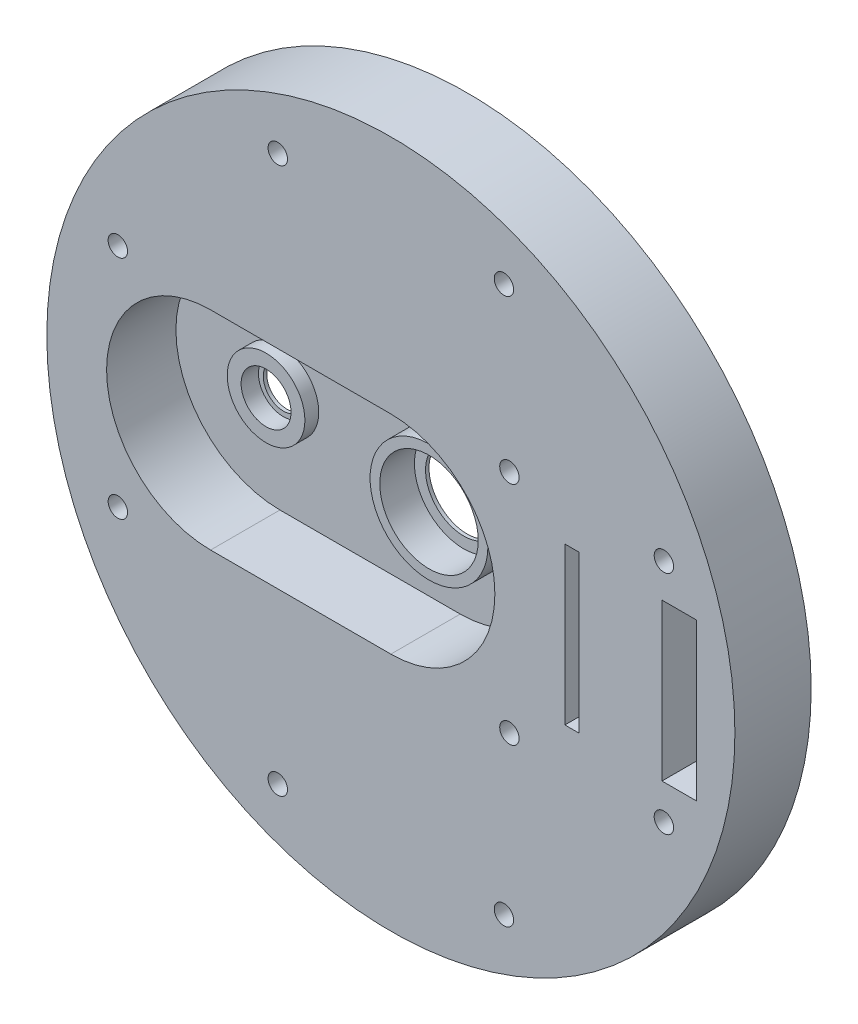
ISO-10303-21;
HEADER;
FILE_DESCRIPTION(('STEP AP214'),'2;1');
FILE_NAME('part.step','',(''),(''),'','','');
FILE_SCHEMA(('AUTOMOTIVE_DESIGN { 1 0 10303 214 1 1 1 1 }'));
ENDSEC;
DATA;
#1=APPLICATION_CONTEXT('core data for automotive mechanical design processes');
#2=APPLICATION_PROTOCOL_DEFINITION('international standard','automotive_design',2000,#1);
#3=PRODUCT_CONTEXT('',#1,'mechanical');
#4=PRODUCT('Part','Part','',(#3));
#5=PRODUCT_RELATED_PRODUCT_CATEGORY('part','',(#4));
#6=PRODUCT_DEFINITION_FORMATION('','',#4);
#7=PRODUCT_DEFINITION_CONTEXT('part definition',#1,'design');
#8=PRODUCT_DEFINITION('design','',#6,#7);
#9=PRODUCT_DEFINITION_SHAPE('','',#8);
#10=(LENGTH_UNIT() NAMED_UNIT(*) SI_UNIT(.MILLI.,.METRE.));
#11=(NAMED_UNIT(*) PLANE_ANGLE_UNIT() SI_UNIT($,.RADIAN.));
#12=(NAMED_UNIT(*) SI_UNIT($,.STERADIAN.) SOLID_ANGLE_UNIT());
#13=UNCERTAINTY_MEASURE_WITH_UNIT(LENGTH_MEASURE(1.E-05),#10,'distance_accuracy_value','');
#14=(GEOMETRIC_REPRESENTATION_CONTEXT(3) GLOBAL_UNCERTAINTY_ASSIGNED_CONTEXT((#13)) GLOBAL_UNIT_ASSIGNED_CONTEXT((#10,
#11,#12)) REPRESENTATION_CONTEXT('',''));
#15=CARTESIAN_POINT('',(0.,0.,0.));
#16=DIRECTION('',(0.,0.,1.));
#17=DIRECTION('',(1.,0.,0.));
#18=AXIS2_PLACEMENT_3D('',#15,#16,#17);
#19=CARTESIAN_POINT('',(0.,0.,0.));
#20=DIRECTION('',(0.,0.,1.));
#21=DIRECTION('',(1.,0.,0.));
#22=AXIS2_PLACEMENT_3D('',#19,#20,#21);
#23=PLANE('',#22);
#24=CARTESIAN_POINT('',(17.1,16.3,0.));
#25=DIRECTION('',(0.,0.,1.));
#26=DIRECTION('',(1.,0.,0.));
#27=AXIS2_PLACEMENT_3D('',#24,#25,#26);
#28=CIRCLE('',#27,1.40000000000219);
#29=CARTESIAN_POINT('',(18.5000000000022,16.3,0.));
#30=VERTEX_POINT('',#29);
#31=EDGE_CURVE('E138',#30,#30,#28,.T.);
#32=ORIENTED_EDGE('',*,*,#31,.T.);
#33=EDGE_LOOP('',(#32));
#34=FACE_BOUND('',#33,.T.);
#35=DIRECTION('',(1.,0.,0.));
#36=VECTOR('',#35,1.);
#37=CARTESIAN_POINT('',(44.1,-11.3,0.));
#38=LINE('',#37,#36);
#39=CARTESIAN_POINT('',(39.1,-11.3,0.));
#40=VERTEX_POINT('',#39);
#41=CARTESIAN_POINT('',(44.1,-11.3,0.));
#42=VERTEX_POINT('',#41);
#43=EDGE_CURVE('E50',#40,#42,#38,.T.);
#44=ORIENTED_EDGE('',*,*,#43,.T.);
#45=DIRECTION('',(0.,1.,0.));
#46=VECTOR('',#45,1.);
#47=CARTESIAN_POINT('',(44.1,-11.3,0.));
#48=LINE('',#47,#46);
#49=CARTESIAN_POINT('',(44.1,11.3,0.));
#50=VERTEX_POINT('',#49);
#51=EDGE_CURVE('E146',#42,#50,#48,.T.);
#52=ORIENTED_EDGE('',*,*,#51,.T.);
#53=DIRECTION('',(-1.,0.,0.));
#54=VECTOR('',#53,1.);
#55=CARTESIAN_POINT('',(44.1,11.3,0.));
#56=LINE('',#55,#54);
#57=CARTESIAN_POINT('',(39.1,11.3,0.));
#58=VERTEX_POINT('',#57);
#59=EDGE_CURVE('E153',#50,#58,#56,.T.);
#60=ORIENTED_EDGE('',*,*,#59,.T.);
#61=DIRECTION('',(0.,-1.,0.));
#62=VECTOR('',#61,1.);
#63=CARTESIAN_POINT('',(39.1,-11.3,0.));
#64=LINE('',#63,#62);
#65=EDGE_CURVE('E132',#58,#40,#64,.T.);
#66=ORIENTED_EDGE('',*,*,#65,.T.);
#67=EDGE_LOOP('',(#44,#52,#60,#66));
#68=FACE_BOUND('',#67,.T.);
#69=CARTESIAN_POINT('',(17.1,-16.3,0.));
#70=DIRECTION('',(0.,0.,1.));
#71=DIRECTION('',(1.,0.,0.));
#72=AXIS2_PLACEMENT_3D('',#69,#70,#71);
#73=CIRCLE('',#72,1.40000000000219);
#74=CARTESIAN_POINT('',(18.5000000000022,-16.3,0.));
#75=VERTEX_POINT('',#74);
#76=EDGE_CURVE('E161',#75,#75,#73,.T.);
#77=ORIENTED_EDGE('',*,*,#76,.T.);
#78=EDGE_LOOP('',(#77));
#79=FACE_BOUND('',#78,.T.);
#80=CARTESIAN_POINT('',(0.,0.,0.));
#81=DIRECTION('',(0.,0.,1.));
#82=DIRECTION('',(1.,0.,0.));
#83=AXIS2_PLACEMENT_3D('',#80,#81,#82);
#84=CIRCLE('',#83,49.62);
#85=CARTESIAN_POINT('',(49.62,0.,0.));
#86=VERTEX_POINT('',#85);
#87=EDGE_CURVE('E11',#86,#86,#84,.T.);
#88=ORIENTED_EDGE('',*,*,#87,.F.);
#89=EDGE_LOOP('',(#88));
#90=FACE_BOUND('',#89,.T.);
#91=CARTESIAN_POINT('',(-26.,0.,0.));
#92=DIRECTION('',(0.,0.,1.));
#93=DIRECTION('',(1.,0.,0.));
#94=AXIS2_PLACEMENT_3D('',#91,#92,#93);
#95=CIRCLE('',#94,2.9);
#96=CARTESIAN_POINT('',(-23.1,0.,0.));
#97=VERTEX_POINT('',#96);
#98=EDGE_CURVE('E277',#97,#97,#95,.F.);
#99=ORIENTED_EDGE('',*,*,#98,.F.);
#100=EDGE_LOOP('',(#99));
#101=FACE_BOUND('',#100,.T.);
#102=CARTESIAN_POINT('',(0.,0.,0.));
#103=DIRECTION('',(0.,0.,1.));
#104=DIRECTION('',(1.,0.,0.));
#105=AXIS2_PLACEMENT_3D('',#102,#103,#104);
#106=CIRCLE('',#105,5.5);
#107=CARTESIAN_POINT('',(5.5,0.,0.));
#108=VERTEX_POINT('',#107);
#109=EDGE_CURVE('E259',#108,#108,#106,.F.);
#110=ORIENTED_EDGE('',*,*,#109,.F.);
#111=EDGE_LOOP('',(#110));
#112=FACE_BOUND('',#111,.T.);
#113=CARTESIAN_POINT('',(-39.375745675631,16.3099678874002,0.));
#114=DIRECTION('',(0.,0.,1.));
#115=DIRECTION('',(1.,0.,0.));
#116=AXIS2_PLACEMENT_3D('',#113,#114,#115);
#117=CIRCLE('',#116,1.4);
#118=CARTESIAN_POINT('',(-37.975745675631,16.3099678874002,0.));
#119=VERTEX_POINT('',#118);
#120=EDGE_CURVE('E244',#119,#119,#117,.F.);
#121=ORIENTED_EDGE('',*,*,#120,.F.);
#122=EDGE_LOOP('',(#121));
#123=FACE_BOUND('',#122,.T.);
#124=CARTESIAN_POINT('',(-39.3757456756311,-16.3099678874002,0.));
#125=DIRECTION('',(0.,0.,1.));
#126=DIRECTION('',(1.,0.,0.));
#127=AXIS2_PLACEMENT_3D('',#124,#125,#126);
#128=CIRCLE('',#127,1.40000000000137);
#129=CARTESIAN_POINT('',(-37.9757456756297,-16.3099678874002,0.));
#130=VERTEX_POINT('',#129);
#131=EDGE_CURVE('E211',#130,#130,#128,.F.);
#132=ORIENTED_EDGE('',*,*,#131,.F.);
#133=EDGE_LOOP('',(#132));
#134=FACE_BOUND('',#133,.T.);
#135=CARTESIAN_POINT('',(-16.3099678874001,-39.3757456756312,0.));
#136=DIRECTION('',(0.,0.,1.));
#137=DIRECTION('',(1.,0.,0.));
#138=AXIS2_PLACEMENT_3D('',#135,#136,#137);
#139=CIRCLE('',#138,1.40000000000258);
#140=CARTESIAN_POINT('',(-14.9099678873975,-39.3757456756312,0.));
#141=VERTEX_POINT('',#140);
#142=EDGE_CURVE('E204',#141,#141,#139,.F.);
#143=ORIENTED_EDGE('',*,*,#142,.F.);
#144=EDGE_LOOP('',(#143));
#145=FACE_BOUND('',#144,.T.);
#146=CARTESIAN_POINT('',(16.3099678874002,-39.3757456756312,0.));
#147=DIRECTION('',(0.,0.,1.));
#148=DIRECTION('',(1.,0.,0.));
#149=AXIS2_PLACEMENT_3D('',#146,#147,#148);
#150=CIRCLE('',#149,1.40000000000291);
#151=CARTESIAN_POINT('',(17.7099678874031,-39.3757456756312,0.));
#152=VERTEX_POINT('',#151);
#153=EDGE_CURVE('E203',#152,#152,#150,.F.);
#154=ORIENTED_EDGE('',*,*,#153,.F.);
#155=EDGE_LOOP('',(#154));
#156=FACE_BOUND('',#155,.T.);
#157=CARTESIAN_POINT('',(39.3757456756312,-16.3099678874003,0.));
#158=DIRECTION('',(0.,0.,1.));
#159=DIRECTION('',(1.,0.,0.));
#160=AXIS2_PLACEMENT_3D('',#157,#158,#159);
#161=CIRCLE('',#160,1.40000000000219);
#162=CARTESIAN_POINT('',(40.7757456756334,-16.3099678874003,0.));
#163=VERTEX_POINT('',#162);
#164=EDGE_CURVE('E235',#163,#163,#161,.F.);
#165=ORIENTED_EDGE('',*,*,#164,.F.);
#166=EDGE_LOOP('',(#165));
#167=FACE_BOUND('',#166,.T.);
#168=CARTESIAN_POINT('',(39.3757456756312,16.3099678874,0.));
#169=DIRECTION('',(0.,0.,1.));
#170=DIRECTION('',(1.,0.,0.));
#171=AXIS2_PLACEMENT_3D('',#168,#169,#170);
#172=CIRCLE('',#171,1.40000000000082);
#173=CARTESIAN_POINT('',(40.7757456756321,16.3099678874,0.));
#174=VERTEX_POINT('',#173);
#175=EDGE_CURVE('E229',#174,#174,#172,.F.);
#176=ORIENTED_EDGE('',*,*,#175,.F.);
#177=EDGE_LOOP('',(#176));
#178=FACE_BOUND('',#177,.T.);
#179=CARTESIAN_POINT('',(16.3099678874003,39.375745675631,0.));
#180=DIRECTION('',(0.,0.,1.));
#181=DIRECTION('',(1.,0.,0.));
#182=AXIS2_PLACEMENT_3D('',#179,#180,#181);
#183=CIRCLE('',#182,1.39999999999962);
#184=CARTESIAN_POINT('',(17.7099678873999,39.375745675631,0.));
#185=VERTEX_POINT('',#184);
#186=EDGE_CURVE('E222',#185,#185,#183,.F.);
#187=ORIENTED_EDGE('',*,*,#186,.F.);
#188=EDGE_LOOP('',(#187));
#189=FACE_BOUND('',#188,.T.);
#190=CARTESIAN_POINT('',(-16.3099678874,39.3757456756311,0.));
#191=DIRECTION('',(0.,0.,1.));
#192=DIRECTION('',(1.,0.,0.));
#193=AXIS2_PLACEMENT_3D('',#190,#191,#192);
#194=CIRCLE('',#193,1.39999999999928);
#195=CARTESIAN_POINT('',(-14.9099678874008,39.3757456756311,0.));
#196=VERTEX_POINT('',#195);
#197=EDGE_CURVE('E221',#196,#196,#194,.F.);
#198=ORIENTED_EDGE('',*,*,#197,.F.);
#199=EDGE_LOOP('',(#198));
#200=FACE_BOUND('',#199,.T.);
#201=DIRECTION('',(0.,-1.,0.));
#202=VECTOR('',#201,1.);
#203=CARTESIAN_POINT('',(25.1,-11.3,0.));
#204=LINE('',#203,#202);
#205=CARTESIAN_POINT('',(25.1,11.3,0.));
#206=VERTEX_POINT('',#205);
#207=CARTESIAN_POINT('',(25.1,-11.3,0.));
#208=VERTEX_POINT('',#207);
#209=EDGE_CURVE('E178',#206,#208,#204,.T.);
#210=ORIENTED_EDGE('',*,*,#209,.T.);
#211=DIRECTION('',(1.,0.,0.));
#212=VECTOR('',#211,1.);
#213=CARTESIAN_POINT('',(27.1,-11.3,0.));
#214=LINE('',#213,#212);
#215=CARTESIAN_POINT('',(27.1,-11.3,0.));
#216=VERTEX_POINT('',#215);
#217=EDGE_CURVE('E181',#208,#216,#214,.T.);
#218=ORIENTED_EDGE('',*,*,#217,.T.);
#219=DIRECTION('',(0.,1.,0.));
#220=VECTOR('',#219,1.);
#221=CARTESIAN_POINT('',(27.1,11.3,0.));
#222=LINE('',#221,#220);
#223=CARTESIAN_POINT('',(27.1,11.3,0.));
#224=VERTEX_POINT('',#223);
#225=EDGE_CURVE('E185',#216,#224,#222,.T.);
#226=ORIENTED_EDGE('',*,*,#225,.T.);
#227=DIRECTION('',(-1.,0.,0.));
#228=VECTOR('',#227,1.);
#229=CARTESIAN_POINT('',(25.1,11.3,0.));
#230=LINE('',#229,#228);
#231=EDGE_CURVE('E170',#224,#206,#230,.T.);
#232=ORIENTED_EDGE('',*,*,#231,.T.);
#233=EDGE_LOOP('',(#210,#218,#226,#232));
#234=FACE_BOUND('',#233,.T.);
#235=ADVANCED_FACE('F35',(#34,#68,#79,#90,#101,#112,#123,#134,#145,#156,#167,#178,#189,#200,
#234),#23,.F.);
#236=CARTESIAN_POINT('',(0.,0.,11.));
#237=DIRECTION('',(0.,0.,1.));
#238=DIRECTION('',(1.,0.,0.));
#239=AXIS2_PLACEMENT_3D('',#236,#237,#238);
#240=PLANE('',#239);
#241=CARTESIAN_POINT('',(17.1,16.3,11.));
#242=DIRECTION('',(0.,0.,1.));
#243=DIRECTION('',(1.,0.,0.));
#244=AXIS2_PLACEMENT_3D('',#241,#242,#243);
#245=CIRCLE('',#244,1.40000000000219);
#246=CARTESIAN_POINT('',(18.5000000000022,16.3,11.));
#247=VERTEX_POINT('',#246);
#248=EDGE_CURVE('E182',#247,#247,#245,.T.);
#249=ORIENTED_EDGE('',*,*,#248,.F.);
#250=EDGE_LOOP('',(#249));
#251=FACE_BOUND('',#250,.T.);
#252=DIRECTION('',(0.,1.,0.));
#253=VECTOR('',#252,1.);
#254=CARTESIAN_POINT('',(44.1,-11.3,11.));
#255=LINE('',#254,#253);
#256=CARTESIAN_POINT('',(44.1,-11.3,11.));
#257=VERTEX_POINT('',#256);
#258=CARTESIAN_POINT('',(44.1,11.3,11.));
#259=VERTEX_POINT('',#258);
#260=EDGE_CURVE('E144',#257,#259,#255,.T.);
#261=ORIENTED_EDGE('',*,*,#260,.F.);
#262=DIRECTION('',(1.,0.,0.));
#263=VECTOR('',#262,1.);
#264=CARTESIAN_POINT('',(44.1,-11.3,11.));
#265=LINE('',#264,#263);
#266=CARTESIAN_POINT('',(39.1,-11.3,11.));
#267=VERTEX_POINT('',#266);
#268=EDGE_CURVE('E126',#267,#257,#265,.T.);
#269=ORIENTED_EDGE('',*,*,#268,.F.);
#270=DIRECTION('',(0.,-1.,0.));
#271=VECTOR('',#270,1.);
#272=CARTESIAN_POINT('',(39.1,-11.3,11.));
#273=LINE('',#272,#271);
#274=CARTESIAN_POINT('',(39.1,11.3,11.));
#275=VERTEX_POINT('',#274);
#276=EDGE_CURVE('E135',#275,#267,#273,.T.);
#277=ORIENTED_EDGE('',*,*,#276,.F.);
#278=DIRECTION('',(-1.,0.,0.));
#279=VECTOR('',#278,1.);
#280=CARTESIAN_POINT('',(44.1,11.3,11.));
#281=LINE('',#280,#279);
#282=EDGE_CURVE('E58',#259,#275,#281,.T.);
#283=ORIENTED_EDGE('',*,*,#282,.F.);
#284=EDGE_LOOP('',(#261,#269,#277,#283));
#285=FACE_BOUND('',#284,.T.);
#286=CARTESIAN_POINT('',(17.1,-16.3,11.));
#287=DIRECTION('',(0.,0.,1.));
#288=DIRECTION('',(1.,0.,0.));
#289=AXIS2_PLACEMENT_3D('',#286,#287,#288);
#290=CIRCLE('',#289,1.40000000000219);
#291=CARTESIAN_POINT('',(18.5000000000022,-16.3,11.));
#292=VERTEX_POINT('',#291);
#293=EDGE_CURVE('E164',#292,#292,#290,.T.);
#294=ORIENTED_EDGE('',*,*,#293,.F.);
#295=EDGE_LOOP('',(#294));
#296=FACE_BOUND('',#295,.T.);
#297=CARTESIAN_POINT('',(-16.3099678874,39.3757456756311,11.));
#298=DIRECTION('',(0.,0.,1.));
#299=DIRECTION('',(1.,0.,0.));
#300=AXIS2_PLACEMENT_3D('',#297,#298,#299);
#301=CIRCLE('',#300,1.39999999999928);
#302=CARTESIAN_POINT('',(-14.9099678874008,39.3757456756311,11.));
#303=VERTEX_POINT('',#302);
#304=EDGE_CURVE('E218',#303,#303,#301,.T.);
#305=ORIENTED_EDGE('',*,*,#304,.F.);
#306=EDGE_LOOP('',(#305));
#307=FACE_BOUND('',#306,.T.);
#308=CARTESIAN_POINT('',(16.3099678874003,39.375745675631,11.));
#309=DIRECTION('',(0.,0.,1.));
#310=DIRECTION('',(1.,0.,0.));
#311=AXIS2_PLACEMENT_3D('',#308,#309,#310);
#312=CIRCLE('',#311,1.39999999999962);
#313=CARTESIAN_POINT('',(17.7099678873999,39.375745675631,11.));
#314=VERTEX_POINT('',#313);
#315=EDGE_CURVE('E226',#314,#314,#312,.T.);
#316=ORIENTED_EDGE('',*,*,#315,.F.);
#317=EDGE_LOOP('',(#316));
#318=FACE_BOUND('',#317,.T.);
#319=CARTESIAN_POINT('',(39.3757456756312,16.3099678874,11.));
#320=DIRECTION('',(0.,0.,1.));
#321=DIRECTION('',(1.,0.,0.));
#322=AXIS2_PLACEMENT_3D('',#319,#320,#321);
#323=CIRCLE('',#322,1.40000000000082);
#324=CARTESIAN_POINT('',(40.7757456756321,16.3099678874,11.));
#325=VERTEX_POINT('',#324);
#326=EDGE_CURVE('E232',#325,#325,#323,.T.);
#327=ORIENTED_EDGE('',*,*,#326,.F.);
#328=EDGE_LOOP('',(#327));
#329=FACE_BOUND('',#328,.T.);
#330=CARTESIAN_POINT('',(39.3757456756312,-16.3099678874003,11.));
#331=DIRECTION('',(0.,0.,1.));
#332=DIRECTION('',(1.,0.,0.));
#333=AXIS2_PLACEMENT_3D('',#330,#331,#332);
#334=CIRCLE('',#333,1.40000000000219);
#335=CARTESIAN_POINT('',(40.7757456756334,-16.3099678874003,11.));
#336=VERTEX_POINT('',#335);
#337=EDGE_CURVE('E207',#336,#336,#334,.T.);
#338=ORIENTED_EDGE('',*,*,#337,.F.);
#339=EDGE_LOOP('',(#338));
#340=FACE_BOUND('',#339,.T.);
#341=CARTESIAN_POINT('',(16.3099678874002,-39.3757456756312,11.));
#342=DIRECTION('',(0.,0.,1.));
#343=DIRECTION('',(1.,0.,0.));
#344=AXIS2_PLACEMENT_3D('',#341,#342,#343);
#345=CIRCLE('',#344,1.40000000000291);
#346=CARTESIAN_POINT('',(17.7099678874031,-39.3757456756312,11.));
#347=VERTEX_POINT('',#346);
#348=EDGE_CURVE('E200',#347,#347,#345,.T.);
#349=ORIENTED_EDGE('',*,*,#348,.F.);
#350=EDGE_LOOP('',(#349));
#351=FACE_BOUND('',#350,.T.);
#352=CARTESIAN_POINT('',(-16.3099678874001,-39.3757456756312,11.));
#353=DIRECTION('',(0.,0.,1.));
#354=DIRECTION('',(1.,0.,0.));
#355=AXIS2_PLACEMENT_3D('',#352,#353,#354);
#356=CIRCLE('',#355,1.40000000000258);
#357=CARTESIAN_POINT('',(-14.9099678873975,-39.3757456756312,11.));
#358=VERTEX_POINT('',#357);
#359=EDGE_CURVE('E208',#358,#358,#356,.T.);
#360=ORIENTED_EDGE('',*,*,#359,.F.);
#361=EDGE_LOOP('',(#360));
#362=FACE_BOUND('',#361,.T.);
#363=CARTESIAN_POINT('',(-39.3757456756311,-16.3099678874002,11.));
#364=DIRECTION('',(0.,0.,1.));
#365=DIRECTION('',(1.,0.,0.));
#366=AXIS2_PLACEMENT_3D('',#363,#364,#365);
#367=CIRCLE('',#366,1.40000000000137);
#368=CARTESIAN_POINT('',(-37.9757456756297,-16.3099678874002,11.));
#369=VERTEX_POINT('',#368);
#370=EDGE_CURVE('E199',#369,#369,#367,.T.);
#371=ORIENTED_EDGE('',*,*,#370,.F.);
#372=EDGE_LOOP('',(#371));
#373=FACE_BOUND('',#372,.T.);
#374=CARTESIAN_POINT('',(-39.375745675631,16.3099678874002,11.));
#375=DIRECTION('',(0.,0.,1.));
#376=DIRECTION('',(1.,0.,0.));
#377=AXIS2_PLACEMENT_3D('',#374,#375,#376);
#378=CIRCLE('',#377,1.4);
#379=CARTESIAN_POINT('',(-37.975745675631,16.3099678874002,11.));
#380=VERTEX_POINT('',#379);
#381=EDGE_CURVE('E225',#380,#380,#378,.T.);
#382=ORIENTED_EDGE('',*,*,#381,.F.);
#383=EDGE_LOOP('',(#382));
#384=FACE_BOUND('',#383,.T.);
#385=CARTESIAN_POINT('',(0.,0.,11.));
#386=DIRECTION('',(0.,0.,1.));
#387=DIRECTION('',(1.,0.,0.));
#388=AXIS2_PLACEMENT_3D('',#385,#386,#387);
#389=CIRCLE('',#388,49.62);
#390=CARTESIAN_POINT('',(49.62,0.,11.));
#391=VERTEX_POINT('',#390);
#392=EDGE_CURVE('E43',#391,#391,#389,.T.);
#393=ORIENTED_EDGE('',*,*,#392,.T.);
#394=EDGE_LOOP('',(#393));
#395=FACE_BOUND('',#394,.T.);
#396=DIRECTION('',(1.,0.,0.));
#397=VECTOR('',#396,1.);
#398=CARTESIAN_POINT('',(-26.,-15.,11.));
#399=LINE('',#398,#397);
#400=CARTESIAN_POINT('',(-26.,-15.,11.));
#401=VERTEX_POINT('',#400);
#402=CARTESIAN_POINT('',(0.,-15.,11.));
#403=VERTEX_POINT('',#402);
#404=EDGE_CURVE('E286',#401,#403,#399,.T.);
#405=ORIENTED_EDGE('',*,*,#404,.F.);
#406=CARTESIAN_POINT('',(-26.,0.,11.));
#407=DIRECTION('',(0.,0.,1.));
#408=DIRECTION('',(1.,0.,0.));
#409=AXIS2_PLACEMENT_3D('',#406,#407,#408);
#410=CIRCLE('',#409,15.);
#411=CARTESIAN_POINT('',(-26.,15.,11.));
#412=VERTEX_POINT('',#411);
#413=EDGE_CURVE('E284',#412,#401,#410,.T.);
#414=ORIENTED_EDGE('',*,*,#413,.F.);
#415=DIRECTION('',(-1.,0.,0.));
#416=VECTOR('',#415,1.);
#417=CARTESIAN_POINT('',(-26.,15.,11.));
#418=LINE('',#417,#416);
#419=CARTESIAN_POINT('',(0.,15.,11.));
#420=VERTEX_POINT('',#419);
#421=EDGE_CURVE('E292',#420,#412,#418,.T.);
#422=ORIENTED_EDGE('',*,*,#421,.F.);
#423=CARTESIAN_POINT('',(0.,0.,11.));
#424=DIRECTION('',(0.,0.,1.));
#425=DIRECTION('',(1.,0.,0.));
#426=AXIS2_PLACEMENT_3D('',#423,#424,#425);
#427=CIRCLE('',#426,15.);
#428=EDGE_CURVE('E289',#403,#420,#427,.T.);
#429=ORIENTED_EDGE('',*,*,#428,.F.);
#430=EDGE_LOOP('',(#405,#414,#422,#429));
#431=FACE_BOUND('',#430,.T.);
#432=DIRECTION('',(1.,0.,0.));
#433=VECTOR('',#432,1.);
#434=CARTESIAN_POINT('',(27.1,-11.3,11.));
#435=LINE('',#434,#433);
#436=CARTESIAN_POINT('',(25.1,-11.3,11.));
#437=VERTEX_POINT('',#436);
#438=CARTESIAN_POINT('',(27.1,-11.3,11.));
#439=VERTEX_POINT('',#438);
#440=EDGE_CURVE('E169',#437,#439,#435,.T.);
#441=ORIENTED_EDGE('',*,*,#440,.F.);
#442=DIRECTION('',(0.,-1.,0.));
#443=VECTOR('',#442,1.);
#444=CARTESIAN_POINT('',(25.1,-11.3,11.));
#445=LINE('',#444,#443);
#446=CARTESIAN_POINT('',(25.1,11.3,11.));
#447=VERTEX_POINT('',#446);
#448=EDGE_CURVE('E167',#447,#437,#445,.T.);
#449=ORIENTED_EDGE('',*,*,#448,.F.);
#450=DIRECTION('',(-1.,0.,0.));
#451=VECTOR('',#450,1.);
#452=CARTESIAN_POINT('',(25.1,11.3,11.));
#453=LINE('',#452,#451);
#454=CARTESIAN_POINT('',(27.1,11.3,11.));
#455=VERTEX_POINT('',#454);
#456=EDGE_CURVE('E175',#455,#447,#453,.T.);
#457=ORIENTED_EDGE('',*,*,#456,.F.);
#458=DIRECTION('',(0.,1.,0.));
#459=VECTOR('',#458,1.);
#460=CARTESIAN_POINT('',(27.1,11.3,11.));
#461=LINE('',#460,#459);
#462=EDGE_CURVE('E172',#439,#455,#461,.T.);
#463=ORIENTED_EDGE('',*,*,#462,.F.);
#464=EDGE_LOOP('',(#441,#449,#457,#463));
#465=FACE_BOUND('',#464,.T.);
#466=ADVANCED_FACE('F141',(#251,#285,#296,#307,#318,#329,#340,#351,#362,#373,#384,#395,#431,
#465),#240,.T.);
#467=CARTESIAN_POINT('',(0.,0.,1.));
#468=DIRECTION('',(0.,0.,1.));
#469=DIRECTION('',(1.,0.,0.));
#470=AXIS2_PLACEMENT_3D('',#467,#468,#469);
#471=PLANE('',#470);
#472=CARTESIAN_POINT('',(-26.,0.,1.));
#473=DIRECTION('',(0.,0.,1.));
#474=DIRECTION('',(1.,0.,0.));
#475=AXIS2_PLACEMENT_3D('',#472,#473,#474);
#476=CIRCLE('',#475,5.6);
#477=CARTESIAN_POINT('',(-20.4,0.,1.));
#478=VERTEX_POINT('',#477);
#479=EDGE_CURVE('E268',#478,#478,#476,.T.);
#480=ORIENTED_EDGE('',*,*,#479,.F.);
#481=EDGE_LOOP('',(#480));
#482=FACE_BOUND('',#481,.T.);
#483=CARTESIAN_POINT('',(-26.,0.,1.));
#484=DIRECTION('',(0.,0.,1.));
#485=DIRECTION('',(1.,0.,0.));
#486=AXIS2_PLACEMENT_3D('',#483,#484,#485);
#487=CIRCLE('',#486,15.);
#488=CARTESIAN_POINT('',(-26.,15.,1.));
#489=VERTEX_POINT('',#488);
#490=CARTESIAN_POINT('',(-26.,-15.,1.));
#491=VERTEX_POINT('',#490);
#492=EDGE_CURVE('E283',#489,#491,#487,.T.);
#493=ORIENTED_EDGE('',*,*,#492,.T.);
#494=DIRECTION('',(1.,0.,0.));
#495=VECTOR('',#494,1.);
#496=CARTESIAN_POINT('',(-26.,-15.,1.));
#497=LINE('',#496,#495);
#498=CARTESIAN_POINT('',(0.,-15.,1.));
#499=VERTEX_POINT('',#498);
#500=EDGE_CURVE('E296',#491,#499,#497,.T.);
#501=ORIENTED_EDGE('',*,*,#500,.T.);
#502=CARTESIAN_POINT('',(0.,0.,1.));
#503=DIRECTION('',(0.,0.,1.));
#504=DIRECTION('',(1.,0.,0.));
#505=AXIS2_PLACEMENT_3D('',#502,#503,#504);
#506=CIRCLE('',#505,15.);
#507=CARTESIAN_POINT('',(0.,15.,1.));
#508=VERTEX_POINT('',#507);
#509=EDGE_CURVE('E298',#499,#508,#506,.T.);
#510=ORIENTED_EDGE('',*,*,#509,.T.);
#511=DIRECTION('',(-1.,0.,0.));
#512=VECTOR('',#511,1.);
#513=CARTESIAN_POINT('',(-26.,15.,1.));
#514=LINE('',#513,#512);
#515=EDGE_CURVE('E287',#508,#489,#514,.T.);
#516=ORIENTED_EDGE('',*,*,#515,.T.);
#517=EDGE_LOOP('',(#493,#501,#510,#516));
#518=FACE_BOUND('',#517,.T.);
#519=CARTESIAN_POINT('',(0.,0.,1.));
#520=DIRECTION('',(0.,0.,1.));
#521=DIRECTION('',(1.,0.,0.));
#522=AXIS2_PLACEMENT_3D('',#519,#520,#521);
#523=CIRCLE('',#522,8.50000000000001);
#524=CARTESIAN_POINT('',(8.50000000000001,0.,1.));
#525=VERTEX_POINT('',#524);
#526=EDGE_CURVE('E250',#525,#525,#523,.T.);
#527=ORIENTED_EDGE('',*,*,#526,.F.);
#528=EDGE_LOOP('',(#527));
#529=FACE_BOUND('',#528,.T.);
#530=ADVANCED_FACE('F318',(#482,#518,#529),#471,.T.);
#531=CARTESIAN_POINT('',(0.,0.,1.));
#532=DIRECTION('',(0.,0.,-1.));
#533=DIRECTION('',(-1.,0.,0.));
#534=AXIS2_PLACEMENT_3D('',#531,#532,#533);
#535=CYLINDRICAL_SURFACE('',#534,49.62);
#536=ORIENTED_EDGE('',*,*,#87,.T.);
#537=EDGE_LOOP('',(#536));
#538=FACE_BOUND('',#537,.T.);
#539=ORIENTED_EDGE('',*,*,#392,.F.);
#540=EDGE_LOOP('',(#539));
#541=FACE_BOUND('',#540,.T.);
#542=ADVANCED_FACE('F37',(#538,#541),#535,.T.);
#543=CARTESIAN_POINT('',(-26.,0.,11.));
#544=DIRECTION('',(0.,0.,-1.));
#545=DIRECTION('',(-1.,0.,0.));
#546=AXIS2_PLACEMENT_3D('',#543,#544,#545);
#547=CYLINDRICAL_SURFACE('',#546,15.);
#548=ORIENTED_EDGE('',*,*,#492,.F.);
#549=DIRECTION('',(0.,0.,-1.));
#550=VECTOR('',#549,1.);
#551=CARTESIAN_POINT('',(-26.,15.,11.));
#552=LINE('',#551,#550);
#553=EDGE_CURVE('E294',#412,#489,#552,.T.);
#554=ORIENTED_EDGE('',*,*,#553,.F.);
#555=ORIENTED_EDGE('',*,*,#413,.T.);
#556=DIRECTION('',(0.,0.,-1.));
#557=VECTOR('',#556,1.);
#558=CARTESIAN_POINT('',(-26.,-15.,11.));
#559=LINE('',#558,#557);
#560=EDGE_CURVE('E309',#401,#491,#559,.T.);
#561=ORIENTED_EDGE('',*,*,#560,.T.);
#562=EDGE_LOOP('',(#548,#554,#555,#561));
#563=FACE_BOUND('',#562,.T.);
#564=ADVANCED_FACE('F317',(#563),#547,.F.);
#565=CARTESIAN_POINT('',(-26.,-15.,11.));
#566=DIRECTION('',(0.,1.,0.));
#567=DIRECTION('',(-1.,0.,0.));
#568=AXIS2_PLACEMENT_3D('',#565,#566,#567);
#569=PLANE('',#568);
#570=ORIENTED_EDGE('',*,*,#500,.F.);
#571=ORIENTED_EDGE('',*,*,#560,.F.);
#572=ORIENTED_EDGE('',*,*,#404,.T.);
#573=DIRECTION('',(0.,0.,-1.));
#574=VECTOR('',#573,1.);
#575=CARTESIAN_POINT('',(0.,-15.,11.));
#576=LINE('',#575,#574);
#577=EDGE_CURVE('E306',#403,#499,#576,.T.);
#578=ORIENTED_EDGE('',*,*,#577,.T.);
#579=EDGE_LOOP('',(#570,#571,#572,#578));
#580=FACE_BOUND('',#579,.T.);
#581=ADVANCED_FACE('F324',(#580),#569,.T.);
#582=CARTESIAN_POINT('',(0.,0.,11.));
#583=DIRECTION('',(0.,0.,-1.));
#584=DIRECTION('',(-1.,0.,0.));
#585=AXIS2_PLACEMENT_3D('',#582,#583,#584);
#586=CYLINDRICAL_SURFACE('',#585,15.);
#587=ORIENTED_EDGE('',*,*,#509,.F.);
#588=ORIENTED_EDGE('',*,*,#577,.F.);
#589=ORIENTED_EDGE('',*,*,#428,.T.);
#590=DIRECTION('',(0.,0.,-1.));
#591=VECTOR('',#590,1.);
#592=CARTESIAN_POINT('',(0.,15.,11.));
#593=LINE('',#592,#591);
#594=EDGE_CURVE('E303',#420,#508,#593,.T.);
#595=ORIENTED_EDGE('',*,*,#594,.T.);
#596=EDGE_LOOP('',(#587,#588,#589,#595));
#597=FACE_BOUND('',#596,.T.);
#598=ADVANCED_FACE('F342',(#597),#586,.F.);
#599=CARTESIAN_POINT('',(-26.,15.,11.));
#600=DIRECTION('',(0.,-1.,0.));
#601=DIRECTION('',(1.,0.,0.));
#602=AXIS2_PLACEMENT_3D('',#599,#600,#601);
#603=PLANE('',#602);
#604=ORIENTED_EDGE('',*,*,#515,.F.);
#605=ORIENTED_EDGE('',*,*,#594,.F.);
#606=ORIENTED_EDGE('',*,*,#421,.T.);
#607=ORIENTED_EDGE('',*,*,#553,.T.);
#608=EDGE_LOOP('',(#604,#605,#606,#607));
#609=FACE_BOUND('',#608,.T.);
#610=ADVANCED_FACE('F346',(#609),#603,.T.);
#611=CARTESIAN_POINT('',(-26.,0.,0.5));
#612=DIRECTION('',(0.,0.,1.));
#613=DIRECTION('',(1.,0.,0.));
#614=AXIS2_PLACEMENT_3D('',#611,#612,#613);
#615=CYLINDRICAL_SURFACE('',#614,3.6);
#616=CARTESIAN_POINT('',(-26.,0.,0.5));
#617=DIRECTION('',(0.,0.,1.));
#618=DIRECTION('',(1.,0.,0.));
#619=AXIS2_PLACEMENT_3D('',#616,#617,#618);
#620=CIRCLE('',#619,3.6);
#621=CARTESIAN_POINT('',(-22.4,0.,0.5));
#622=VERTEX_POINT('',#621);
#623=EDGE_CURVE('E280',#622,#622,#620,.T.);
#624=ORIENTED_EDGE('',*,*,#623,.F.);
#625=EDGE_LOOP('',(#624));
#626=FACE_BOUND('',#625,.T.);
#627=CARTESIAN_POINT('',(-26.,0.,3.));
#628=DIRECTION('',(0.,0.,1.));
#629=DIRECTION('',(1.,0.,0.));
#630=AXIS2_PLACEMENT_3D('',#627,#628,#629);
#631=CIRCLE('',#630,3.6);
#632=CARTESIAN_POINT('',(-22.4,0.,3.));
#633=VERTEX_POINT('',#632);
#634=EDGE_CURVE('E265',#633,#633,#631,.T.);
#635=ORIENTED_EDGE('',*,*,#634,.T.);
#636=EDGE_LOOP('',(#635));
#637=FACE_BOUND('',#636,.T.);
#638=ADVANCED_FACE('F350',(#626,#637),#615,.F.);
#639=CARTESIAN_POINT('',(-26.,0.,0.5));
#640=DIRECTION('',(0.,0.,1.));
#641=DIRECTION('',(1.,0.,0.));
#642=AXIS2_PLACEMENT_3D('',#639,#640,#641);
#643=PLANE('',#642);
#644=CARTESIAN_POINT('',(-26.,0.,0.5));
#645=DIRECTION('',(0.,0.,1.));
#646=DIRECTION('',(1.,0.,0.));
#647=AXIS2_PLACEMENT_3D('',#644,#645,#646);
#648=CIRCLE('',#647,2.9);
#649=CARTESIAN_POINT('',(-23.1,0.,0.5));
#650=VERTEX_POINT('',#649);
#651=EDGE_CURVE('E272',#650,#650,#648,.T.);
#652=ORIENTED_EDGE('',*,*,#651,.F.);
#653=EDGE_LOOP('',(#652));
#654=FACE_BOUND('',#653,.T.);
#655=ORIENTED_EDGE('',*,*,#623,.T.);
#656=EDGE_LOOP('',(#655));
#657=FACE_BOUND('',#656,.T.);
#658=ADVANCED_FACE('F354',(#654,#657),#643,.T.);
#659=CARTESIAN_POINT('',(-26.,0.,-0.00100000000000002));
#660=DIRECTION('',(0.,0.,1.));
#661=DIRECTION('',(1.,0.,0.));
#662=AXIS2_PLACEMENT_3D('',#659,#660,#661);
#663=CYLINDRICAL_SURFACE('',#662,2.9);
#664=ORIENTED_EDGE('',*,*,#651,.T.);
#665=EDGE_LOOP('',(#664));
#666=FACE_BOUND('',#665,.T.);
#667=ORIENTED_EDGE('',*,*,#98,.T.);
#668=EDGE_LOOP('',(#667));
#669=FACE_BOUND('',#668,.T.);
#670=ADVANCED_FACE('F358',(#666,#669),#663,.F.);
#671=CARTESIAN_POINT('',(-26.,0.,3.));
#672=DIRECTION('',(0.,0.,1.));
#673=DIRECTION('',(1.,0.,0.));
#674=AXIS2_PLACEMENT_3D('',#671,#672,#673);
#675=PLANE('',#674);
#676=CARTESIAN_POINT('',(-26.,0.,3.));
#677=DIRECTION('',(0.,0.,1.));
#678=DIRECTION('',(1.,0.,0.));
#679=AXIS2_PLACEMENT_3D('',#676,#677,#678);
#680=CIRCLE('',#679,5.6);
#681=CARTESIAN_POINT('',(-20.4,0.,3.));
#682=VERTEX_POINT('',#681);
#683=EDGE_CURVE('E269',#682,#682,#680,.T.);
#684=ORIENTED_EDGE('',*,*,#683,.T.);
#685=EDGE_LOOP('',(#684));
#686=FACE_BOUND('',#685,.T.);
#687=ORIENTED_EDGE('',*,*,#634,.F.);
#688=EDGE_LOOP('',(#687));
#689=FACE_BOUND('',#688,.T.);
#690=ADVANCED_FACE('F362',(#686,#689),#675,.T.);
#691=CARTESIAN_POINT('',(-26.,0.,3.));
#692=DIRECTION('',(0.,0.,-1.));
#693=DIRECTION('',(-1.,0.,0.));
#694=AXIS2_PLACEMENT_3D('',#691,#692,#693);
#695=CYLINDRICAL_SURFACE('',#694,5.6);
#696=ORIENTED_EDGE('',*,*,#683,.F.);
#697=EDGE_LOOP('',(#696));
#698=FACE_BOUND('',#697,.T.);
#699=ORIENTED_EDGE('',*,*,#479,.T.);
#700=EDGE_LOOP('',(#699));
#701=FACE_BOUND('',#700,.T.);
#702=ADVANCED_FACE('F364',(#698,#701),#695,.T.);
#703=CARTESIAN_POINT('',(0.,0.,-19.5818325856979));
#704=DIRECTION('',(0.,0.,1.));
#705=DIRECTION('',(1.,0.,0.));
#706=AXIS2_PLACEMENT_3D('',#703,#704,#705);
#707=CYLINDRICAL_SURFACE('',#706,7.1);
#708=CARTESIAN_POINT('',(0.,0.,0.5));
#709=DIRECTION('',(0.,0.,1.));
#710=DIRECTION('',(1.,0.,0.));
#711=AXIS2_PLACEMENT_3D('',#708,#709,#710);
#712=CIRCLE('',#711,7.1);
#713=CARTESIAN_POINT('',(7.1,0.,0.5));
#714=VERTEX_POINT('',#713);
#715=EDGE_CURVE('E262',#714,#714,#712,.F.);
#716=ORIENTED_EDGE('',*,*,#715,.T.);
#717=EDGE_LOOP('',(#716));
#718=FACE_BOUND('',#717,.T.);
#719=CARTESIAN_POINT('',(0.,0.,5.5));
#720=DIRECTION('',(0.,0.,1.));
#721=DIRECTION('',(1.,0.,0.));
#722=AXIS2_PLACEMENT_3D('',#719,#720,#721);
#723=CIRCLE('',#722,7.1);
#724=CARTESIAN_POINT('',(7.1,0.,5.5));
#725=VERTEX_POINT('',#724);
#726=EDGE_CURVE('E247',#725,#725,#723,.T.);
#727=ORIENTED_EDGE('',*,*,#726,.T.);
#728=EDGE_LOOP('',(#727));
#729=FACE_BOUND('',#728,.T.);
#730=ADVANCED_FACE('F367',(#718,#729),#707,.F.);
#731=CARTESIAN_POINT('',(-26.,0.,0.5));
#732=DIRECTION('',(0.,0.,1.));
#733=DIRECTION('',(1.,0.,0.));
#734=AXIS2_PLACEMENT_3D('',#731,#732,#733);
#735=PLANE('',#734);
#736=CARTESIAN_POINT('',(0.,0.,0.5));
#737=DIRECTION('',(0.,0.,1.));
#738=DIRECTION('',(1.,0.,0.));
#739=AXIS2_PLACEMENT_3D('',#736,#737,#738);
#740=CIRCLE('',#739,5.5);
#741=CARTESIAN_POINT('',(5.5,0.,0.5));
#742=VERTEX_POINT('',#741);
#743=EDGE_CURVE('E254',#742,#742,#740,.T.);
#744=ORIENTED_EDGE('',*,*,#743,.F.);
#745=EDGE_LOOP('',(#744));
#746=FACE_BOUND('',#745,.T.);
#747=ORIENTED_EDGE('',*,*,#715,.F.);
#748=EDGE_LOOP('',(#747));
#749=FACE_BOUND('',#748,.T.);
#750=ADVANCED_FACE('F374',(#746,#749),#735,.T.);
#751=CARTESIAN_POINT('',(0.,0.,-0.00100000000000002));
#752=DIRECTION('',(0.,0.,1.));
#753=DIRECTION('',(1.,0.,0.));
#754=AXIS2_PLACEMENT_3D('',#751,#752,#753);
#755=CYLINDRICAL_SURFACE('',#754,5.5);
#756=ORIENTED_EDGE('',*,*,#743,.T.);
#757=EDGE_LOOP('',(#756));
#758=FACE_BOUND('',#757,.T.);
#759=ORIENTED_EDGE('',*,*,#109,.T.);
#760=EDGE_LOOP('',(#759));
#761=FACE_BOUND('',#760,.T.);
#762=ADVANCED_FACE('F378',(#758,#761),#755,.F.);
#763=CARTESIAN_POINT('',(0.,0.,5.5));
#764=DIRECTION('',(0.,0.,1.));
#765=DIRECTION('',(1.,0.,0.));
#766=AXIS2_PLACEMENT_3D('',#763,#764,#765);
#767=PLANE('',#766);
#768=CARTESIAN_POINT('',(0.,0.,5.5));
#769=DIRECTION('',(0.,0.,1.));
#770=DIRECTION('',(1.,0.,0.));
#771=AXIS2_PLACEMENT_3D('',#768,#769,#770);
#772=CIRCLE('',#771,8.50000000000001);
#773=CARTESIAN_POINT('',(8.50000000000001,0.,5.5));
#774=VERTEX_POINT('',#773);
#775=EDGE_CURVE('E251',#774,#774,#772,.T.);
#776=ORIENTED_EDGE('',*,*,#775,.T.);
#777=EDGE_LOOP('',(#776));
#778=FACE_BOUND('',#777,.T.);
#779=ORIENTED_EDGE('',*,*,#726,.F.);
#780=EDGE_LOOP('',(#779));
#781=FACE_BOUND('',#780,.T.);
#782=ADVANCED_FACE('F382',(#778,#781),#767,.T.);
#783=CARTESIAN_POINT('',(0.,0.,5.5));
#784=DIRECTION('',(0.,0.,-1.));
#785=DIRECTION('',(-1.,0.,0.));
#786=AXIS2_PLACEMENT_3D('',#783,#784,#785);
#787=CYLINDRICAL_SURFACE('',#786,8.50000000000001);
#788=ORIENTED_EDGE('',*,*,#775,.F.);
#789=EDGE_LOOP('',(#788));
#790=FACE_BOUND('',#789,.T.);
#791=ORIENTED_EDGE('',*,*,#526,.T.);
#792=EDGE_LOOP('',(#791));
#793=FACE_BOUND('',#792,.T.);
#794=ADVANCED_FACE('F384',(#790,#793),#787,.T.);
#795=CARTESIAN_POINT('',(-39.375745675631,16.3099678874002,-0.000999999999999265));
#796=DIRECTION('',(0.,0.,1.));
#797=DIRECTION('',(1.,0.,0.));
#798=AXIS2_PLACEMENT_3D('',#795,#796,#797);
#799=CYLINDRICAL_SURFACE('',#798,1.4);
#800=ORIENTED_EDGE('',*,*,#381,.T.);
#801=EDGE_LOOP('',(#800));
#802=FACE_BOUND('',#801,.T.);
#803=ORIENTED_EDGE('',*,*,#120,.T.);
#804=EDGE_LOOP('',(#803));
#805=FACE_BOUND('',#804,.T.);
#806=ADVANCED_FACE('F387',(#802,#805),#799,.F.);
#807=CARTESIAN_POINT('',(-39.3757456756311,-16.3099678874002,-0.000999999999999265));
#808=DIRECTION('',(0.,0.,1.));
#809=DIRECTION('',(1.,0.,0.));
#810=AXIS2_PLACEMENT_3D('',#807,#808,#809);
#811=CYLINDRICAL_SURFACE('',#810,1.40000000000137);
#812=ORIENTED_EDGE('',*,*,#370,.T.);
#813=EDGE_LOOP('',(#812));
#814=FACE_BOUND('',#813,.T.);
#815=ORIENTED_EDGE('',*,*,#131,.T.);
#816=EDGE_LOOP('',(#815));
#817=FACE_BOUND('',#816,.T.);
#818=ADVANCED_FACE('F394',(#814,#817),#811,.F.);
#819=CARTESIAN_POINT('',(-16.3099678874001,-39.3757456756312,-0.000999999999999265));
#820=DIRECTION('',(0.,0.,1.));
#821=DIRECTION('',(1.,0.,0.));
#822=AXIS2_PLACEMENT_3D('',#819,#820,#821);
#823=CYLINDRICAL_SURFACE('',#822,1.40000000000258);
#824=ORIENTED_EDGE('',*,*,#359,.T.);
#825=EDGE_LOOP('',(#824));
#826=FACE_BOUND('',#825,.T.);
#827=ORIENTED_EDGE('',*,*,#142,.T.);
#828=EDGE_LOOP('',(#827));
#829=FACE_BOUND('',#828,.T.);
#830=ADVANCED_FACE('F416',(#826,#829),#823,.F.);
#831=CARTESIAN_POINT('',(16.3099678874002,-39.3757456756312,-0.000999999999999265));
#832=DIRECTION('',(0.,0.,1.));
#833=DIRECTION('',(1.,0.,0.));
#834=AXIS2_PLACEMENT_3D('',#831,#832,#833);
#835=CYLINDRICAL_SURFACE('',#834,1.40000000000291);
#836=ORIENTED_EDGE('',*,*,#348,.T.);
#837=EDGE_LOOP('',(#836));
#838=FACE_BOUND('',#837,.T.);
#839=ORIENTED_EDGE('',*,*,#153,.T.);
#840=EDGE_LOOP('',(#839));
#841=FACE_BOUND('',#840,.T.);
#842=ADVANCED_FACE('F400',(#838,#841),#835,.F.);
#843=CARTESIAN_POINT('',(39.3757456756312,-16.3099678874003,-0.000999999999999265));
#844=DIRECTION('',(0.,0.,1.));
#845=DIRECTION('',(1.,0.,0.));
#846=AXIS2_PLACEMENT_3D('',#843,#844,#845);
#847=CYLINDRICAL_SURFACE('',#846,1.40000000000219);
#848=ORIENTED_EDGE('',*,*,#337,.T.);
#849=EDGE_LOOP('',(#848));
#850=FACE_BOUND('',#849,.T.);
#851=ORIENTED_EDGE('',*,*,#164,.T.);
#852=EDGE_LOOP('',(#851));
#853=FACE_BOUND('',#852,.T.);
#854=ADVANCED_FACE('F396',(#850,#853),#847,.F.);
#855=CARTESIAN_POINT('',(39.3757456756312,16.3099678874,-0.000999999999999265));
#856=DIRECTION('',(0.,0.,1.));
#857=DIRECTION('',(1.,0.,0.));
#858=AXIS2_PLACEMENT_3D('',#855,#856,#857);
#859=CYLINDRICAL_SURFACE('',#858,1.40000000000082);
#860=ORIENTED_EDGE('',*,*,#326,.T.);
#861=EDGE_LOOP('',(#860));
#862=FACE_BOUND('',#861,.T.);
#863=ORIENTED_EDGE('',*,*,#175,.T.);
#864=EDGE_LOOP('',(#863));
#865=FACE_BOUND('',#864,.T.);
#866=ADVANCED_FACE('F399',(#862,#865),#859,.F.);
#867=CARTESIAN_POINT('',(16.3099678874003,39.375745675631,-0.000999999999999265));
#868=DIRECTION('',(0.,0.,1.));
#869=DIRECTION('',(1.,0.,0.));
#870=AXIS2_PLACEMENT_3D('',#867,#868,#869);
#871=CYLINDRICAL_SURFACE('',#870,1.39999999999962);
#872=ORIENTED_EDGE('',*,*,#315,.T.);
#873=EDGE_LOOP('',(#872));
#874=FACE_BOUND('',#873,.T.);
#875=ORIENTED_EDGE('',*,*,#186,.T.);
#876=EDGE_LOOP('',(#875));
#877=FACE_BOUND('',#876,.T.);
#878=ADVANCED_FACE('F404',(#874,#877),#871,.F.);
#879=CARTESIAN_POINT('',(-16.3099678874,39.3757456756311,-0.000999999999999265));
#880=DIRECTION('',(0.,0.,1.));
#881=DIRECTION('',(1.,0.,0.));
#882=AXIS2_PLACEMENT_3D('',#879,#880,#881);
#883=CYLINDRICAL_SURFACE('',#882,1.39999999999928);
#884=ORIENTED_EDGE('',*,*,#304,.T.);
#885=EDGE_LOOP('',(#884));
#886=FACE_BOUND('',#885,.T.);
#887=ORIENTED_EDGE('',*,*,#197,.T.);
#888=EDGE_LOOP('',(#887));
#889=FACE_BOUND('',#888,.T.);
#890=ADVANCED_FACE('F408',(#886,#889),#883,.F.);
#891=CARTESIAN_POINT('',(25.1,-11.3,11.));
#892=DIRECTION('',(1.,0.,0.));
#893=DIRECTION('',(0.,0.,-1.));
#894=AXIS2_PLACEMENT_3D('',#891,#892,#893);
#895=PLANE('',#894);
#896=ORIENTED_EDGE('',*,*,#209,.F.);
#897=DIRECTION('',(0.,0.,-1.));
#898=VECTOR('',#897,1.);
#899=CARTESIAN_POINT('',(25.1,11.3,11.));
#900=LINE('',#899,#898);
#901=EDGE_CURVE('E177',#447,#206,#900,.T.);
#902=ORIENTED_EDGE('',*,*,#901,.F.);
#903=ORIENTED_EDGE('',*,*,#448,.T.);
#904=DIRECTION('',(0.,0.,-1.));
#905=VECTOR('',#904,1.);
#906=CARTESIAN_POINT('',(25.1,-11.3,11.));
#907=LINE('',#906,#905);
#908=EDGE_CURVE('E196',#437,#208,#907,.T.);
#909=ORIENTED_EDGE('',*,*,#908,.T.);
#910=EDGE_LOOP('',(#896,#902,#903,#909));
#911=FACE_BOUND('',#910,.T.);
#912=ADVANCED_FACE('F412',(#911),#895,.T.);
#913=CARTESIAN_POINT('',(27.1,-11.3,11.));
#914=DIRECTION('',(0.,1.,0.));
#915=DIRECTION('',(0.,0.,1.));
#916=AXIS2_PLACEMENT_3D('',#913,#914,#915);
#917=PLANE('',#916);
#918=ORIENTED_EDGE('',*,*,#217,.F.);
#919=ORIENTED_EDGE('',*,*,#908,.F.);
#920=ORIENTED_EDGE('',*,*,#440,.T.);
#921=DIRECTION('',(0.,0.,-1.));
#922=VECTOR('',#921,1.);
#923=CARTESIAN_POINT('',(27.1,-11.3,11.));
#924=LINE('',#923,#922);
#925=EDGE_CURVE('E194',#439,#216,#924,.T.);
#926=ORIENTED_EDGE('',*,*,#925,.T.);
#927=EDGE_LOOP('',(#918,#919,#920,#926));
#928=FACE_BOUND('',#927,.T.);
#929=ADVANCED_FACE('F426',(#928),#917,.T.);
#930=CARTESIAN_POINT('',(27.1,11.3,11.));
#931=DIRECTION('',(-1.,0.,0.));
#932=DIRECTION('',(0.,0.,1.));
#933=AXIS2_PLACEMENT_3D('',#930,#931,#932);
#934=PLANE('',#933);
#935=ORIENTED_EDGE('',*,*,#225,.F.);
#936=ORIENTED_EDGE('',*,*,#925,.F.);
#937=ORIENTED_EDGE('',*,*,#462,.T.);
#938=DIRECTION('',(0.,0.,-1.));
#939=VECTOR('',#938,1.);
#940=CARTESIAN_POINT('',(27.1,11.3,11.));
#941=LINE('',#940,#939);
#942=EDGE_CURVE('E192',#455,#224,#941,.T.);
#943=ORIENTED_EDGE('',*,*,#942,.T.);
#944=EDGE_LOOP('',(#935,#936,#937,#943));
#945=FACE_BOUND('',#944,.T.);
#946=ADVANCED_FACE('F430',(#945),#934,.T.);
#947=CARTESIAN_POINT('',(25.1,11.3,11.));
#948=DIRECTION('',(0.,-1.,0.));
#949=DIRECTION('',(0.,0.,-1.));
#950=AXIS2_PLACEMENT_3D('',#947,#948,#949);
#951=PLANE('',#950);
#952=ORIENTED_EDGE('',*,*,#231,.F.);
#953=ORIENTED_EDGE('',*,*,#942,.F.);
#954=ORIENTED_EDGE('',*,*,#456,.T.);
#955=ORIENTED_EDGE('',*,*,#901,.T.);
#956=EDGE_LOOP('',(#952,#953,#954,#955));
#957=FACE_BOUND('',#956,.T.);
#958=ADVANCED_FACE('F434',(#957),#951,.T.);
#959=CARTESIAN_POINT('',(17.1,-16.3,11.001));
#960=DIRECTION('',(0.,0.,-1.));
#961=DIRECTION('',(-1.,0.,0.));
#962=AXIS2_PLACEMENT_3D('',#959,#960,#961);
#963=CYLINDRICAL_SURFACE('',#962,1.40000000000219);
#964=ORIENTED_EDGE('',*,*,#293,.T.);
#965=EDGE_LOOP('',(#964));
#966=FACE_BOUND('',#965,.T.);
#967=ORIENTED_EDGE('',*,*,#76,.F.);
#968=EDGE_LOOP('',(#967));
#969=FACE_BOUND('',#968,.T.);
#970=ADVANCED_FACE('F438',(#966,#969),#963,.F.);
#971=CARTESIAN_POINT('',(44.1,-11.3,11.001));
#972=DIRECTION('',(0.,1.,0.));
#973=DIRECTION('',(0.,0.,1.));
#974=AXIS2_PLACEMENT_3D('',#971,#972,#973);
#975=PLANE('',#974);
#976=ORIENTED_EDGE('',*,*,#268,.T.);
#977=DIRECTION('',(0.,0.,-1.));
#978=VECTOR('',#977,1.);
#979=CARTESIAN_POINT('',(44.1,-11.3,11.001));
#980=LINE('',#979,#978);
#981=EDGE_CURVE('E139',#257,#42,#980,.T.);
#982=ORIENTED_EDGE('',*,*,#981,.T.);
#983=ORIENTED_EDGE('',*,*,#43,.F.);
#984=DIRECTION('',(0.,0.,-1.));
#985=VECTOR('',#984,1.);
#986=CARTESIAN_POINT('',(39.1,-11.3,11.001));
#987=LINE('',#986,#985);
#988=EDGE_CURVE('E122',#267,#40,#987,.T.);
#989=ORIENTED_EDGE('',*,*,#988,.F.);
#990=EDGE_LOOP('',(#976,#982,#983,#989));
#991=FACE_BOUND('',#990,.T.);
#992=ADVANCED_FACE('F124',(#991),#975,.T.);
#993=CARTESIAN_POINT('',(44.1,-11.3,11.001));
#994=DIRECTION('',(-1.,0.,0.));
#995=DIRECTION('',(0.,0.,1.));
#996=AXIS2_PLACEMENT_3D('',#993,#994,#995);
#997=PLANE('',#996);
#998=ORIENTED_EDGE('',*,*,#260,.T.);
#999=DIRECTION('',(0.,0.,-1.));
#1000=VECTOR('',#999,1.);
#1001=CARTESIAN_POINT('',(44.1,11.3,11.001));
#1002=LINE('',#1001,#1000);
#1003=EDGE_CURVE('E158',#259,#50,#1002,.T.);
#1004=ORIENTED_EDGE('',*,*,#1003,.T.);
#1005=ORIENTED_EDGE('',*,*,#51,.F.);
#1006=ORIENTED_EDGE('',*,*,#981,.F.);
#1007=EDGE_LOOP('',(#998,#1004,#1005,#1006));
#1008=FACE_BOUND('',#1007,.T.);
#1009=ADVANCED_FACE('F445',(#1008),#997,.T.);
#1010=CARTESIAN_POINT('',(44.1,11.3,11.001));
#1011=DIRECTION('',(0.,-1.,0.));
#1012=DIRECTION('',(0.,0.,-1.));
#1013=AXIS2_PLACEMENT_3D('',#1010,#1011,#1012);
#1014=PLANE('',#1013);
#1015=ORIENTED_EDGE('',*,*,#282,.T.);
#1016=DIRECTION('',(0.,0.,-1.));
#1017=VECTOR('',#1016,1.);
#1018=CARTESIAN_POINT('',(39.1,11.3,11.001));
#1019=LINE('',#1018,#1017);
#1020=EDGE_CURVE('E131',#275,#58,#1019,.T.);
#1021=ORIENTED_EDGE('',*,*,#1020,.T.);
#1022=ORIENTED_EDGE('',*,*,#59,.F.);
#1023=ORIENTED_EDGE('',*,*,#1003,.F.);
#1024=EDGE_LOOP('',(#1015,#1021,#1022,#1023));
#1025=FACE_BOUND('',#1024,.T.);
#1026=ADVANCED_FACE('F448',(#1025),#1014,.T.);
#1027=CARTESIAN_POINT('',(39.1,-11.3,11.001));
#1028=DIRECTION('',(1.,0.,0.));
#1029=DIRECTION('',(0.,0.,-1.));
#1030=AXIS2_PLACEMENT_3D('',#1027,#1028,#1029);
#1031=PLANE('',#1030);
#1032=ORIENTED_EDGE('',*,*,#276,.T.);
#1033=ORIENTED_EDGE('',*,*,#988,.T.);
#1034=ORIENTED_EDGE('',*,*,#65,.F.);
#1035=ORIENTED_EDGE('',*,*,#1020,.F.);
#1036=EDGE_LOOP('',(#1032,#1033,#1034,#1035));
#1037=FACE_BOUND('',#1036,.T.);
#1038=ADVANCED_FACE('F136',(#1037),#1031,.T.);
#1039=CARTESIAN_POINT('',(17.1,16.3,11.001));
#1040=DIRECTION('',(0.,0.,-1.));
#1041=DIRECTION('',(-1.,0.,0.));
#1042=AXIS2_PLACEMENT_3D('',#1039,#1040,#1041);
#1043=CYLINDRICAL_SURFACE('',#1042,1.40000000000219);
#1044=ORIENTED_EDGE('',*,*,#248,.T.);
#1045=EDGE_LOOP('',(#1044));
#1046=FACE_BOUND('',#1045,.T.);
#1047=ORIENTED_EDGE('',*,*,#31,.F.);
#1048=EDGE_LOOP('',(#1047));
#1049=FACE_BOUND('',#1048,.T.);
#1050=ADVANCED_FACE('F454',(#1046,#1049),#1043,.F.);
#1051=CLOSED_SHELL('',(#235,#466,#530,#542,#564,#581,#598,#610,#638,#658,#670,#690,#702,#730,
#750,#762,#782,#794,#806,#818,#830,#842,#854,#866,#878,#890,#912,#929,#946,#958,#970,#992,#1009,
#1026,#1038,#1050));
#1052=MANIFOLD_SOLID_BREP('B2',#1051);
#1053=ADVANCED_BREP_SHAPE_REPRESENTATION('',(#18,#1052),#14);
#1054=SHAPE_DEFINITION_REPRESENTATION(#9,#1053);
ENDSEC;
END-ISO-10303-21;
